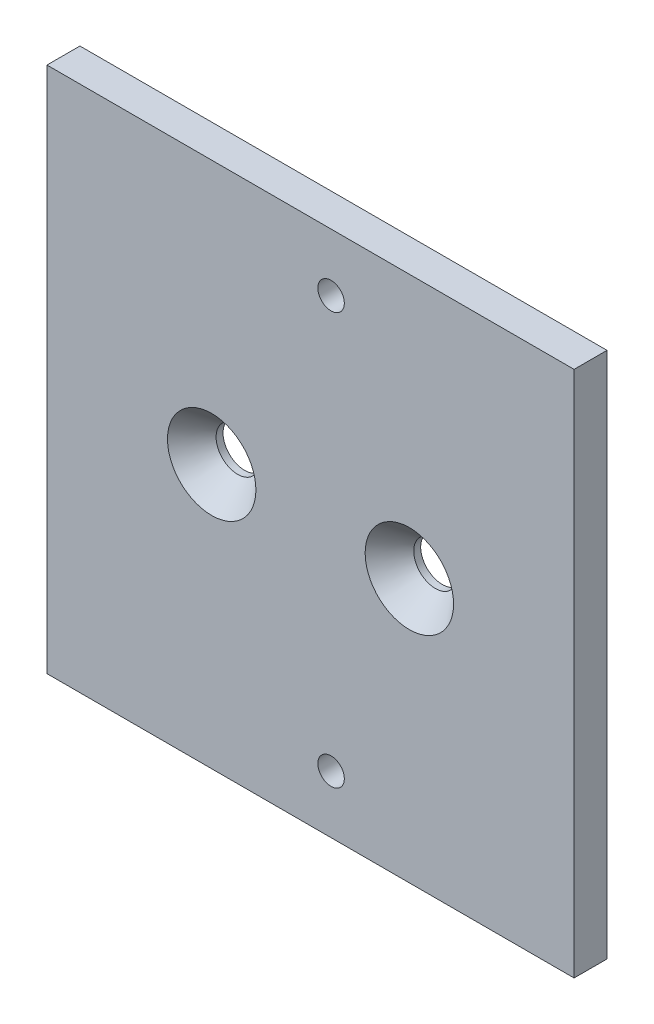
ISO-10303-21;
HEADER;
FILE_DESCRIPTION(('STEP AP214'),'2;1');
FILE_NAME('part.step','',(''),(''),'','','');
FILE_SCHEMA(('AUTOMOTIVE_DESIGN { 1 0 10303 214 1 1 1 1 }'));
ENDSEC;
DATA;
#1=APPLICATION_CONTEXT('core data for automotive mechanical design processes');
#2=APPLICATION_PROTOCOL_DEFINITION('international standard','automotive_design',2000,#1);
#3=PRODUCT_CONTEXT('',#1,'mechanical');
#4=PRODUCT('Part','Part','',(#3));
#5=PRODUCT_RELATED_PRODUCT_CATEGORY('part','',(#4));
#6=PRODUCT_DEFINITION_FORMATION('','',#4);
#7=PRODUCT_DEFINITION_CONTEXT('part definition',#1,'design');
#8=PRODUCT_DEFINITION('design','',#6,#7);
#9=PRODUCT_DEFINITION_SHAPE('','',#8);
#10=(LENGTH_UNIT() NAMED_UNIT(*) SI_UNIT(.MILLI.,.METRE.));
#11=(NAMED_UNIT(*) PLANE_ANGLE_UNIT() SI_UNIT($,.RADIAN.));
#12=(NAMED_UNIT(*) SI_UNIT($,.STERADIAN.) SOLID_ANGLE_UNIT());
#13=UNCERTAINTY_MEASURE_WITH_UNIT(LENGTH_MEASURE(1.E-05),#10,'distance_accuracy_value','');
#14=(GEOMETRIC_REPRESENTATION_CONTEXT(3) GLOBAL_UNCERTAINTY_ASSIGNED_CONTEXT((#13)) GLOBAL_UNIT_ASSIGNED_CONTEXT((#10,
#11,#12)) REPRESENTATION_CONTEXT('',''));
#15=CARTESIAN_POINT('',(0.,0.,0.));
#16=DIRECTION('',(0.,0.,1.));
#17=DIRECTION('',(1.,0.,0.));
#18=AXIS2_PLACEMENT_3D('',#15,#16,#17);
#19=CARTESIAN_POINT('',(0.,0.,3.175));
#20=DIRECTION('',(0.,0.,1.));
#21=DIRECTION('',(1.,0.,0.));
#22=AXIS2_PLACEMENT_3D('',#19,#20,#21);
#23=PLANE('',#22);
#24=CARTESIAN_POINT('',(3.96240000000887,-39.6875000000291,3.175));
#25=DIRECTION('',(0.,0.,1.));
#26=DIRECTION('',(1.,0.,0.));
#27=AXIS2_PLACEMENT_3D('',#24,#25,#26);
#28=CIRCLE('',#27,2.5527);
#29=CARTESIAN_POINT('',(6.51510000000887,-39.6875000000291,3.175));
#30=VERTEX_POINT('',#29);
#31=EDGE_CURVE('E190',#30,#30,#28,.T.);
#32=ORIENTED_EDGE('',*,*,#31,.F.);
#33=EDGE_LOOP('',(#32));
#34=FACE_BOUND('',#33,.T.);
#35=CARTESIAN_POINT('',(3.96240000001686,39.6874999999726,3.175));
#36=DIRECTION('',(0.,0.,1.));
#37=DIRECTION('',(1.,0.,0.));
#38=AXIS2_PLACEMENT_3D('',#35,#36,#37);
#39=CIRCLE('',#38,2.5527);
#40=CARTESIAN_POINT('',(6.51510000001686,39.6874999999726,3.175));
#41=VERTEX_POINT('',#40);
#42=EDGE_CURVE('E181',#41,#41,#39,.T.);
#43=ORIENTED_EDGE('',*,*,#42,.F.);
#44=EDGE_LOOP('',(#43));
#45=FACE_BOUND('',#44,.T.);
#46=CARTESIAN_POINT('',(-19.05,0.,3.175));
#47=DIRECTION('',(0.,0.,-1.));
#48=DIRECTION('',(-1.,0.,0.));
#49=AXIS2_PLACEMENT_3D('',#46,#47,#48);
#50=CIRCLE('',#49,8.5217);
#51=CARTESIAN_POINT('',(-27.5717,0.,3.17499999999999));
#52=VERTEX_POINT('',#51);
#53=EDGE_CURVE('E112',#52,#52,#50,.T.);
#54=ORIENTED_EDGE('',*,*,#53,.T.);
#55=EDGE_LOOP('',(#54));
#56=FACE_BOUND('',#55,.T.);
#57=DIRECTION('',(0.,1.,0.));
#58=VECTOR('',#57,1.);
#59=CARTESIAN_POINT('',(50.8,50.8,3.175));
#60=LINE('',#59,#58);
#61=CARTESIAN_POINT('',(50.8,-50.8,3.175));
#62=VERTEX_POINT('',#61);
#63=CARTESIAN_POINT('',(50.8,50.8,3.175));
#64=VERTEX_POINT('',#63);
#65=EDGE_CURVE('E88',#62,#64,#60,.T.);
#66=ORIENTED_EDGE('',*,*,#65,.T.);
#67=DIRECTION('',(-1.,0.,0.));
#68=VECTOR('',#67,1.);
#69=CARTESIAN_POINT('',(-50.8,50.8,3.175));
#70=LINE('',#69,#68);
#71=CARTESIAN_POINT('',(-50.8,50.8,3.175));
#72=VERTEX_POINT('',#71);
#73=EDGE_CURVE('E83',#64,#72,#70,.T.);
#74=ORIENTED_EDGE('',*,*,#73,.T.);
#75=DIRECTION('',(0.,-1.,0.));
#76=VECTOR('',#75,1.);
#77=CARTESIAN_POINT('',(-50.8,50.8,3.175));
#78=LINE('',#77,#76);
#79=CARTESIAN_POINT('',(-50.8,-50.8,3.175));
#80=VERTEX_POINT('',#79);
#81=EDGE_CURVE('E86',#72,#80,#78,.T.);
#82=ORIENTED_EDGE('',*,*,#81,.T.);
#83=DIRECTION('',(1.,0.,0.));
#84=VECTOR('',#83,1.);
#85=CARTESIAN_POINT('',(-50.8,-50.8,3.175));
#86=LINE('',#85,#84);
#87=EDGE_CURVE('E53',#80,#62,#86,.T.);
#88=ORIENTED_EDGE('',*,*,#87,.T.);
#89=EDGE_LOOP('',(#66,#74,#82,#88));
#90=FACE_BOUND('',#89,.T.);
#91=CARTESIAN_POINT('',(19.05,0.,3.175));
#92=DIRECTION('',(0.,0.,-1.));
#93=DIRECTION('',(-1.,0.,0.));
#94=AXIS2_PLACEMENT_3D('',#91,#92,#93);
#95=CIRCLE('',#94,8.5217);
#96=CARTESIAN_POINT('',(10.5283,0.,3.17499999999999));
#97=VERTEX_POINT('',#96);
#98=EDGE_CURVE('E122',#97,#97,#95,.T.);
#99=ORIENTED_EDGE('',*,*,#98,.T.);
#100=EDGE_LOOP('',(#99));
#101=FACE_BOUND('',#100,.T.);
#102=ADVANCED_FACE('F34',(#34,#45,#56,#90,#101),#23,.T.);
#103=CARTESIAN_POINT('',(19.05,0.,3.175));
#104=DIRECTION('',(0.,0.,-1.));
#105=DIRECTION('',(-1.,0.,0.));
#106=AXIS2_PLACEMENT_3D('',#103,#104,#105);
#107=CYLINDRICAL_SURFACE('',#106,4.1656);
#108=CARTESIAN_POINT('',(19.05,0.,-3.175));
#109=DIRECTION('',(0.,0.,1.));
#110=DIRECTION('',(1.,0.,0.));
#111=AXIS2_PLACEMENT_3D('',#108,#109,#110);
#112=CIRCLE('',#111,4.1656);
#113=CARTESIAN_POINT('',(23.2156,0.,-3.175));
#114=VERTEX_POINT('',#113);
#115=EDGE_CURVE('E111',#114,#114,#112,.T.);
#116=ORIENTED_EDGE('',*,*,#115,.F.);
#117=EDGE_LOOP('',(#116));
#118=FACE_BOUND('',#117,.T.);
#119=CARTESIAN_POINT('',(19.05,0.,-1.83611981869546));
#120=DIRECTION('',(0.,0.,1.));
#121=DIRECTION('',(1.,0.,0.));
#122=AXIS2_PLACEMENT_3D('',#119,#120,#121);
#123=CIRCLE('',#122,4.1656);
#124=CARTESIAN_POINT('',(23.2156,0.,-1.83611981869546));
#125=VERTEX_POINT('',#124);
#126=EDGE_CURVE('E38',#125,#125,#123,.T.);
#127=ORIENTED_EDGE('',*,*,#126,.T.);
#128=EDGE_LOOP('',(#127));
#129=FACE_BOUND('',#128,.T.);
#130=ADVANCED_FACE('F134',(#118,#129),#107,.F.);
#131=CARTESIAN_POINT('',(-19.05,0.,3.175));
#132=DIRECTION('',(0.,0.,-1.));
#133=DIRECTION('',(-1.,0.,0.));
#134=AXIS2_PLACEMENT_3D('',#131,#132,#133);
#135=CYLINDRICAL_SURFACE('',#134,4.1656);
#136=CARTESIAN_POINT('',(-19.05,0.,-3.175));
#137=DIRECTION('',(0.,0.,1.));
#138=DIRECTION('',(1.,0.,0.));
#139=AXIS2_PLACEMENT_3D('',#136,#137,#138);
#140=CIRCLE('',#139,4.1656);
#141=CARTESIAN_POINT('',(-14.8844,0.,-3.175));
#142=VERTEX_POINT('',#141);
#143=EDGE_CURVE('E104',#142,#142,#140,.T.);
#144=ORIENTED_EDGE('',*,*,#143,.F.);
#145=EDGE_LOOP('',(#144));
#146=FACE_BOUND('',#145,.T.);
#147=CARTESIAN_POINT('',(-19.05,0.,-1.83611981869546));
#148=DIRECTION('',(0.,0.,1.));
#149=DIRECTION('',(1.,0.,0.));
#150=AXIS2_PLACEMENT_3D('',#147,#148,#149);
#151=CIRCLE('',#150,4.1656);
#152=CARTESIAN_POINT('',(-14.8844,0.,-1.83611981869546));
#153=VERTEX_POINT('',#152);
#154=EDGE_CURVE('E109',#153,#153,#151,.T.);
#155=ORIENTED_EDGE('',*,*,#154,.T.);
#156=EDGE_LOOP('',(#155));
#157=FACE_BOUND('',#156,.T.);
#158=ADVANCED_FACE('F132',(#146,#157),#135,.F.);
#159=CARTESIAN_POINT('',(0.,0.,-3.175));
#160=DIRECTION('',(0.,0.,1.));
#161=DIRECTION('',(1.,0.,0.));
#162=AXIS2_PLACEMENT_3D('',#159,#160,#161);
#163=PLANE('',#162);
#164=CARTESIAN_POINT('',(3.96240000000887,-39.6875000000291,-3.175));
#165=DIRECTION('',(0.,0.,1.));
#166=DIRECTION('',(1.,0.,0.));
#167=AXIS2_PLACEMENT_3D('',#164,#165,#166);
#168=CIRCLE('',#167,2.5527);
#169=CARTESIAN_POINT('',(6.51510000000887,-39.6875000000291,-3.175));
#170=VERTEX_POINT('',#169);
#171=EDGE_CURVE('E185',#170,#170,#168,.T.);
#172=ORIENTED_EDGE('',*,*,#171,.T.);
#173=EDGE_LOOP('',(#172));
#174=FACE_BOUND('',#173,.T.);
#175=CARTESIAN_POINT('',(3.96240000001686,39.6874999999726,-3.175));
#176=DIRECTION('',(0.,0.,1.));
#177=DIRECTION('',(1.,0.,0.));
#178=AXIS2_PLACEMENT_3D('',#175,#176,#177);
#179=CIRCLE('',#178,2.5527);
#180=CARTESIAN_POINT('',(6.51510000001686,39.6874999999726,-3.175));
#181=VERTEX_POINT('',#180);
#182=EDGE_CURVE('E179',#181,#181,#179,.T.);
#183=ORIENTED_EDGE('',*,*,#182,.T.);
#184=EDGE_LOOP('',(#183));
#185=FACE_BOUND('',#184,.T.);
#186=ORIENTED_EDGE('',*,*,#143,.T.);
#187=EDGE_LOOP('',(#186));
#188=FACE_BOUND('',#187,.T.);
#189=DIRECTION('',(0.,1.,0.));
#190=VECTOR('',#189,1.);
#191=CARTESIAN_POINT('',(50.8,50.8,-3.175));
#192=LINE('',#191,#190);
#193=CARTESIAN_POINT('',(50.8,-50.8,-3.175));
#194=VERTEX_POINT('',#193);
#195=CARTESIAN_POINT('',(50.8,50.8,-3.175));
#196=VERTEX_POINT('',#195);
#197=EDGE_CURVE('E101',#194,#196,#192,.T.);
#198=ORIENTED_EDGE('',*,*,#197,.F.);
#199=DIRECTION('',(1.,0.,0.));
#200=VECTOR('',#199,1.);
#201=CARTESIAN_POINT('',(-50.8,-50.8,-3.175));
#202=LINE('',#201,#200);
#203=CARTESIAN_POINT('',(-50.8,-50.8,-3.175));
#204=VERTEX_POINT('',#203);
#205=EDGE_CURVE('E76',#204,#194,#202,.T.);
#206=ORIENTED_EDGE('',*,*,#205,.F.);
#207=DIRECTION('',(0.,-1.,0.));
#208=VECTOR('',#207,1.);
#209=CARTESIAN_POINT('',(-50.8,50.8,-3.175));
#210=LINE('',#209,#208);
#211=CARTESIAN_POINT('',(-50.8,50.8,-3.175));
#212=VERTEX_POINT('',#211);
#213=EDGE_CURVE('E70',#212,#204,#210,.T.);
#214=ORIENTED_EDGE('',*,*,#213,.F.);
#215=DIRECTION('',(-1.,0.,0.));
#216=VECTOR('',#215,1.);
#217=CARTESIAN_POINT('',(-50.8,50.8,-3.175));
#218=LINE('',#217,#216);
#219=EDGE_CURVE('E92',#196,#212,#218,.T.);
#220=ORIENTED_EDGE('',*,*,#219,.F.);
#221=EDGE_LOOP('',(#198,#206,#214,#220));
#222=FACE_BOUND('',#221,.T.);
#223=ORIENTED_EDGE('',*,*,#115,.T.);
#224=EDGE_LOOP('',(#223));
#225=FACE_BOUND('',#224,.T.);
#226=ADVANCED_FACE('F129',(#174,#185,#188,#222,#225),#163,.F.);
#227=CARTESIAN_POINT('',(50.8,50.8,3.175));
#228=DIRECTION('',(-1.,0.,0.));
#229=DIRECTION('',(0.,-1.,0.));
#230=AXIS2_PLACEMENT_3D('',#227,#228,#229);
#231=PLANE('',#230);
#232=ORIENTED_EDGE('',*,*,#197,.T.);
#233=DIRECTION('',(0.,0.,-1.));
#234=VECTOR('',#233,1.);
#235=CARTESIAN_POINT('',(50.8,50.8,3.175));
#236=LINE('',#235,#234);
#237=EDGE_CURVE('E11',#64,#196,#236,.T.);
#238=ORIENTED_EDGE('',*,*,#237,.F.);
#239=ORIENTED_EDGE('',*,*,#65,.F.);
#240=DIRECTION('',(0.,0.,-1.));
#241=VECTOR('',#240,1.);
#242=CARTESIAN_POINT('',(50.8,-50.8,3.175));
#243=LINE('',#242,#241);
#244=EDGE_CURVE('E97',#62,#194,#243,.T.);
#245=ORIENTED_EDGE('',*,*,#244,.T.);
#246=EDGE_LOOP('',(#232,#238,#239,#245));
#247=FACE_BOUND('',#246,.T.);
#248=ADVANCED_FACE('F36',(#247),#231,.F.);
#249=CARTESIAN_POINT('',(-50.8,50.8,3.175));
#250=DIRECTION('',(0.,-1.,0.));
#251=DIRECTION('',(0.,0.,-1.));
#252=AXIS2_PLACEMENT_3D('',#249,#250,#251);
#253=PLANE('',#252);
#254=ORIENTED_EDGE('',*,*,#219,.T.);
#255=DIRECTION('',(0.,0.,-1.));
#256=VECTOR('',#255,1.);
#257=CARTESIAN_POINT('',(-50.8,50.8,3.175));
#258=LINE('',#257,#256);
#259=EDGE_CURVE('E44',#72,#212,#258,.T.);
#260=ORIENTED_EDGE('',*,*,#259,.F.);
#261=ORIENTED_EDGE('',*,*,#73,.F.);
#262=ORIENTED_EDGE('',*,*,#237,.T.);
#263=EDGE_LOOP('',(#254,#260,#261,#262));
#264=FACE_BOUND('',#263,.T.);
#265=ADVANCED_FACE('F91',(#264),#253,.F.);
#266=CARTESIAN_POINT('',(-50.8,50.8,3.175));
#267=DIRECTION('',(1.,0.,0.));
#268=DIRECTION('',(0.,1.,0.));
#269=AXIS2_PLACEMENT_3D('',#266,#267,#268);
#270=PLANE('',#269);
#271=ORIENTED_EDGE('',*,*,#213,.T.);
#272=DIRECTION('',(0.,0.,-1.));
#273=VECTOR('',#272,1.);
#274=CARTESIAN_POINT('',(-50.8,-50.8,3.175));
#275=LINE('',#274,#273);
#276=EDGE_CURVE('E93',#80,#204,#275,.T.);
#277=ORIENTED_EDGE('',*,*,#276,.F.);
#278=ORIENTED_EDGE('',*,*,#81,.F.);
#279=ORIENTED_EDGE('',*,*,#259,.T.);
#280=EDGE_LOOP('',(#271,#277,#278,#279));
#281=FACE_BOUND('',#280,.T.);
#282=ADVANCED_FACE('F95',(#281),#270,.F.);
#283=CARTESIAN_POINT('',(-50.8,-50.8,3.175));
#284=DIRECTION('',(0.,1.,0.));
#285=DIRECTION('',(0.,0.,1.));
#286=AXIS2_PLACEMENT_3D('',#283,#284,#285);
#287=PLANE('',#286);
#288=ORIENTED_EDGE('',*,*,#205,.T.);
#289=ORIENTED_EDGE('',*,*,#244,.F.);
#290=ORIENTED_EDGE('',*,*,#87,.F.);
#291=ORIENTED_EDGE('',*,*,#276,.T.);
#292=EDGE_LOOP('',(#288,#289,#290,#291));
#293=FACE_BOUND('',#292,.T.);
#294=ADVANCED_FACE('F154',(#293),#287,.F.);
#295=CARTESIAN_POINT('',(-19.05,0.,3.175));
#296=DIRECTION('',(0.,0.,1.));
#297=DIRECTION('',(1.,0.,0.));
#298=AXIS2_PLACEMENT_3D('',#295,#296,#297);
#299=CONICAL_SURFACE('',#298,8.5217,0.715584993317674);
#300=ORIENTED_EDGE('',*,*,#154,.F.);
#301=EDGE_LOOP('',(#300));
#302=FACE_BOUND('',#301,.T.);
#303=ORIENTED_EDGE('',*,*,#53,.F.);
#304=EDGE_LOOP('',(#303));
#305=FACE_BOUND('',#304,.T.);
#306=ADVANCED_FACE('F157',(#302,#305),#299,.F.);
#307=CARTESIAN_POINT('',(19.05,0.,3.175));
#308=DIRECTION('',(0.,0.,1.));
#309=DIRECTION('',(1.,0.,0.));
#310=AXIS2_PLACEMENT_3D('',#307,#308,#309);
#311=CONICAL_SURFACE('',#310,8.5217,0.715584993317674);
#312=ORIENTED_EDGE('',*,*,#126,.F.);
#313=EDGE_LOOP('',(#312));
#314=FACE_BOUND('',#313,.T.);
#315=ORIENTED_EDGE('',*,*,#98,.F.);
#316=EDGE_LOOP('',(#315));
#317=FACE_BOUND('',#316,.T.);
#318=ADVANCED_FACE('F172',(#314,#317),#311,.F.);
#319=CARTESIAN_POINT('',(3.96240000001686,39.6874999999726,3.175));
#320=DIRECTION('',(0.,0.,1.));
#321=DIRECTION('',(1.,0.,0.));
#322=AXIS2_PLACEMENT_3D('',#319,#320,#321);
#323=CYLINDRICAL_SURFACE('',#322,2.5527);
#324=ORIENTED_EDGE('',*,*,#182,.F.);
#325=EDGE_LOOP('',(#324));
#326=FACE_BOUND('',#325,.T.);
#327=ORIENTED_EDGE('',*,*,#42,.T.);
#328=EDGE_LOOP('',(#327));
#329=FACE_BOUND('',#328,.T.);
#330=ADVANCED_FACE('F175',(#326,#329),#323,.F.);
#331=CARTESIAN_POINT('',(3.96240000000887,-39.6875000000291,3.175));
#332=DIRECTION('',(0.,0.,1.));
#333=DIRECTION('',(1.,0.,0.));
#334=AXIS2_PLACEMENT_3D('',#331,#332,#333);
#335=CYLINDRICAL_SURFACE('',#334,2.5527);
#336=ORIENTED_EDGE('',*,*,#171,.F.);
#337=EDGE_LOOP('',(#336));
#338=FACE_BOUND('',#337,.T.);
#339=ORIENTED_EDGE('',*,*,#31,.T.);
#340=EDGE_LOOP('',(#339));
#341=FACE_BOUND('',#340,.T.);
#342=ADVANCED_FACE('F193',(#338,#341),#335,.F.);
#343=CLOSED_SHELL('',(#102,#130,#158,#226,#248,#265,#282,#294,#306,#318,#330,#342));
#344=MANIFOLD_SOLID_BREP('B2',#343);
#345=ADVANCED_BREP_SHAPE_REPRESENTATION('',(#18,#344),#14);
#346=SHAPE_DEFINITION_REPRESENTATION(#9,#345);
ENDSEC;
END-ISO-10303-21;
